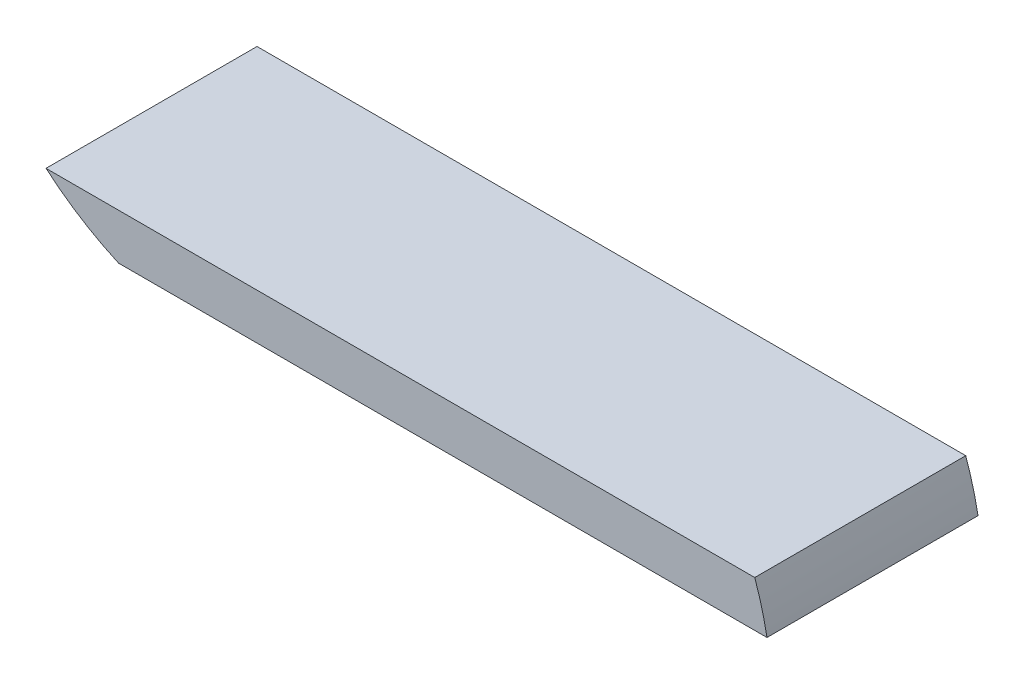
ISO-10303-21;
HEADER;
FILE_DESCRIPTION(('STEP AP214'),'2;1');
FILE_NAME('part.step','',(''),(''),'','','');
FILE_SCHEMA(('AUTOMOTIVE_DESIGN { 1 0 10303 214 1 1 1 1 }'));
ENDSEC;
DATA;
#1=APPLICATION_CONTEXT('core data for automotive mechanical design processes');
#2=APPLICATION_PROTOCOL_DEFINITION('international standard','automotive_design',2000,#1);
#3=PRODUCT_CONTEXT('',#1,'mechanical');
#4=PRODUCT('Part','Part','',(#3));
#5=PRODUCT_RELATED_PRODUCT_CATEGORY('part','',(#4));
#6=PRODUCT_DEFINITION_FORMATION('','',#4);
#7=PRODUCT_DEFINITION_CONTEXT('part definition',#1,'design');
#8=PRODUCT_DEFINITION('design','',#6,#7);
#9=PRODUCT_DEFINITION_SHAPE('','',#8);
#10=(LENGTH_UNIT() NAMED_UNIT(*) SI_UNIT(.MILLI.,.METRE.));
#11=(NAMED_UNIT(*) PLANE_ANGLE_UNIT() SI_UNIT($,.RADIAN.));
#12=(NAMED_UNIT(*) SI_UNIT($,.STERADIAN.) SOLID_ANGLE_UNIT());
#13=UNCERTAINTY_MEASURE_WITH_UNIT(LENGTH_MEASURE(1.E-05),#10,'distance_accuracy_value','');
#14=(GEOMETRIC_REPRESENTATION_CONTEXT(3) GLOBAL_UNCERTAINTY_ASSIGNED_CONTEXT((#13)) GLOBAL_UNIT_ASSIGNED_CONTEXT((#10,
#11,#12)) REPRESENTATION_CONTEXT('',''));
#15=CARTESIAN_POINT('',(0.,0.,0.));
#16=DIRECTION('',(0.,0.,1.));
#17=DIRECTION('',(1.,0.,0.));
#18=AXIS2_PLACEMENT_3D('',#15,#16,#17);
#19=CARTESIAN_POINT('',(-27.040171186799,6.037186226117,0.));
#20=DIRECTION('',(0.,-1.,0.));
#21=DIRECTION('',(1.,0.,0.));
#22=AXIS2_PLACEMENT_3D('',#19,#20,#21);
#23=PLANE('',#22);
#24=DIRECTION('',(-1.,0.,0.));
#25=VECTOR('',#24,1.);
#26=CARTESIAN_POINT('',(-26.732884015051,6.037186226117,0.));
#27=LINE('',#26,#25);
#28=CARTESIAN_POINT('',(-26.732884015051,6.037186226117,0.));
#29=VERTEX_POINT('',#28);
#30=CARTESIAN_POINT('',(-27.040171186799,6.037186226117,0.));
#31=VERTEX_POINT('',#30);
#32=EDGE_CURVE('E11',#29,#31,#27,.T.);
#33=ORIENTED_EDGE('',*,*,#32,.F.);
#34=DIRECTION('',(0.,0.,1.));
#35=VECTOR('',#34,1.);
#36=CARTESIAN_POINT('',(-26.732884015051,6.037186226117,0.));
#37=LINE('',#36,#35);
#38=CARTESIAN_POINT('',(-26.732884015051,6.037186226117,0.1));
#39=VERTEX_POINT('',#38);
#40=EDGE_CURVE('E24',#29,#39,#37,.T.);
#41=ORIENTED_EDGE('',*,*,#40,.T.);
#42=DIRECTION('',(1.,0.,0.));
#43=VECTOR('',#42,1.);
#44=CARTESIAN_POINT('',(-26.732884015051,6.037186226117,0.1));
#45=LINE('',#44,#43);
#46=CARTESIAN_POINT('',(-27.040171186799,6.037186226117,0.1));
#47=VERTEX_POINT('',#46);
#48=EDGE_CURVE('E75',#47,#39,#45,.T.);
#49=ORIENTED_EDGE('',*,*,#48,.F.);
#50=DIRECTION('',(0.,0.,1.));
#51=VECTOR('',#50,1.);
#52=CARTESIAN_POINT('',(-27.040171186799,6.037186226117,0.));
#53=LINE('',#52,#51);
#54=EDGE_CURVE('E85',#31,#47,#53,.T.);
#55=ORIENTED_EDGE('',*,*,#54,.F.);
#56=EDGE_LOOP('',(#33,#41,#49,#55));
#57=FACE_BOUND('',#56,.T.);
#58=ADVANCED_FACE('F17',(#57),#23,.T.);
#59=CARTESIAN_POINT('',(-26.983342085285,6.165251438178,0.));
#60=DIRECTION('',(0.,0.,1.));
#61=DIRECTION('',(0.6511395397524,0.758958035579723,0.));
#62=AXIS2_PLACEMENT_3D('',#59,#60,#61);
#63=CYLINDRICAL_SURFACE('',#62,0.140107977356891);
#64=CARTESIAN_POINT('',(-26.983342085285,6.165251438178,0.));
#65=DIRECTION('',(0.,0.,-1.));
#66=DIRECTION('',(0.6511395397524,0.758958035579723,0.));
#67=AXIS2_PLACEMENT_3D('',#64,#65,#66);
#68=CIRCLE('',#67,0.140107977356891);
#69=CARTESIAN_POINT('',(-27.074571929177,6.058915362914,0.));
#70=VERTEX_POINT('',#69);
#71=EDGE_CURVE('E83',#31,#70,#68,.T.);
#72=ORIENTED_EDGE('',*,*,#71,.F.);
#73=ORIENTED_EDGE('',*,*,#54,.T.);
#74=CARTESIAN_POINT('',(-26.983342085285,6.165251438178,0.1));
#75=DIRECTION('',(0.,0.,1.));
#76=DIRECTION('',(0.6511395397524,0.758958035579723,0.));
#77=AXIS2_PLACEMENT_3D('',#74,#75,#76);
#78=CIRCLE('',#77,0.140107977356891);
#79=CARTESIAN_POINT('',(-27.074571929177,6.058915362914,0.1));
#80=VERTEX_POINT('',#79);
#81=EDGE_CURVE('E81',#80,#47,#78,.T.);
#82=ORIENTED_EDGE('',*,*,#81,.F.);
#83=DIRECTION('',(0.,0.,1.));
#84=VECTOR('',#83,1.);
#85=CARTESIAN_POINT('',(-27.074571929177,6.058915362914,0.));
#86=LINE('',#85,#84);
#87=EDGE_CURVE('E61',#70,#80,#86,.T.);
#88=ORIENTED_EDGE('',*,*,#87,.F.);
#89=EDGE_LOOP('',(#72,#73,#82,#88));
#90=FACE_BOUND('',#89,.T.);
#91=ADVANCED_FACE('F91',(#90),#63,.T.);
#92=CARTESIAN_POINT('',(-26.738690849672,6.058915362914,0.));
#93=DIRECTION('',(0.,1.,0.));
#94=DIRECTION('',(-1.,0.,0.));
#95=AXIS2_PLACEMENT_3D('',#92,#93,#94);
#96=PLANE('',#95);
#97=DIRECTION('',(1.,0.,0.));
#98=VECTOR('',#97,1.);
#99=CARTESIAN_POINT('',(-27.074571929177,6.058915362914,0.));
#100=LINE('',#99,#98);
#101=CARTESIAN_POINT('',(-26.738690849672,6.058915362914,0.));
#102=VERTEX_POINT('',#101);
#103=EDGE_CURVE('E65',#70,#102,#100,.T.);
#104=ORIENTED_EDGE('',*,*,#103,.F.);
#105=ORIENTED_EDGE('',*,*,#87,.T.);
#106=DIRECTION('',(-1.,0.,0.));
#107=VECTOR('',#106,1.);
#108=CARTESIAN_POINT('',(-27.074571929177,6.058915362914,0.1));
#109=LINE('',#108,#107);
#110=CARTESIAN_POINT('',(-26.738690849672,6.058915362914,0.1));
#111=VERTEX_POINT('',#110);
#112=EDGE_CURVE('E54',#111,#80,#109,.T.);
#113=ORIENTED_EDGE('',*,*,#112,.F.);
#114=DIRECTION('',(0.,0.,1.));
#115=VECTOR('',#114,1.);
#116=CARTESIAN_POINT('',(-26.738690849672,6.058915362914,0.));
#117=LINE('',#116,#115);
#118=EDGE_CURVE('E58',#102,#111,#117,.T.);
#119=ORIENTED_EDGE('',*,*,#118,.F.);
#120=EDGE_LOOP('',(#104,#105,#113,#119));
#121=FACE_BOUND('',#120,.T.);
#122=ADVANCED_FACE('F57',(#121),#96,.T.);
#123=CARTESIAN_POINT('',(-26.871812170946,6.011699918327,0.));
#124=DIRECTION('',(0.,0.,1.));
#125=DIRECTION('',(-0.983586275823382,-0.180438460456438,0.));
#126=AXIS2_PLACEMENT_3D('',#123,#124,#125);
#127=CYLINDRICAL_SURFACE('',#126,0.14124653760403);
#128=CARTESIAN_POINT('',(-26.871812170946,6.011699918327,0.));
#129=DIRECTION('',(0.,0.,-1.));
#130=DIRECTION('',(-0.983586275823382,-0.180438460456438,0.));
#131=AXIS2_PLACEMENT_3D('',#128,#129,#130);
#132=CIRCLE('',#131,0.14124653760403);
#133=EDGE_CURVE('E71',#102,#29,#132,.T.);
#134=ORIENTED_EDGE('',*,*,#133,.F.);
#135=ORIENTED_EDGE('',*,*,#118,.T.);
#136=CARTESIAN_POINT('',(-26.871812170946,6.011699918327,0.1));
#137=DIRECTION('',(0.,0.,1.));
#138=DIRECTION('',(-0.983586275823382,-0.180438460456438,0.));
#139=AXIS2_PLACEMENT_3D('',#136,#137,#138);
#140=CIRCLE('',#139,0.14124653760403);
#141=EDGE_CURVE('E70',#39,#111,#140,.T.);
#142=ORIENTED_EDGE('',*,*,#141,.F.);
#143=ORIENTED_EDGE('',*,*,#40,.F.);
#144=EDGE_LOOP('',(#134,#135,#142,#143));
#145=FACE_BOUND('',#144,.T.);
#146=ADVANCED_FACE('F69',(#145),#127,.T.);
#147=CARTESIAN_POINT('',(-26.900210288412,6.048465373062,0.));
#148=DIRECTION('',(0.,0.,1.));
#149=DIRECTION('',(1.,0.,0.));
#150=AXIS2_PLACEMENT_3D('',#147,#148,#149);
#151=PLANE('',#150);
#152=ORIENTED_EDGE('',*,*,#133,.T.);
#153=ORIENTED_EDGE('',*,*,#32,.T.);
#154=ORIENTED_EDGE('',*,*,#71,.T.);
#155=ORIENTED_EDGE('',*,*,#103,.T.);
#156=EDGE_LOOP('',(#152,#153,#154,#155));
#157=FACE_BOUND('',#156,.T.);
#158=ADVANCED_FACE('F88',(#157),#151,.F.);
#159=CARTESIAN_POINT('',(-26.900210288412,6.048465373062,0.1));
#160=DIRECTION('',(0.,0.,1.));
#161=DIRECTION('',(1.,0.,0.));
#162=AXIS2_PLACEMENT_3D('',#159,#160,#161);
#163=PLANE('',#162);
#164=ORIENTED_EDGE('',*,*,#141,.T.);
#165=ORIENTED_EDGE('',*,*,#112,.T.);
#166=ORIENTED_EDGE('',*,*,#81,.T.);
#167=ORIENTED_EDGE('',*,*,#48,.T.);
#168=EDGE_LOOP('',(#164,#165,#166,#167));
#169=FACE_BOUND('',#168,.T.);
#170=ADVANCED_FACE('F74',(#169),#163,.T.);
#171=CLOSED_SHELL('',(#58,#91,#122,#146,#158,#170));
#172=MANIFOLD_SOLID_BREP('B1',#171);
#173=ADVANCED_BREP_SHAPE_REPRESENTATION('',(#18,#172),#14);
#174=SHAPE_DEFINITION_REPRESENTATION(#9,#173);
ENDSEC;
END-ISO-10303-21;
